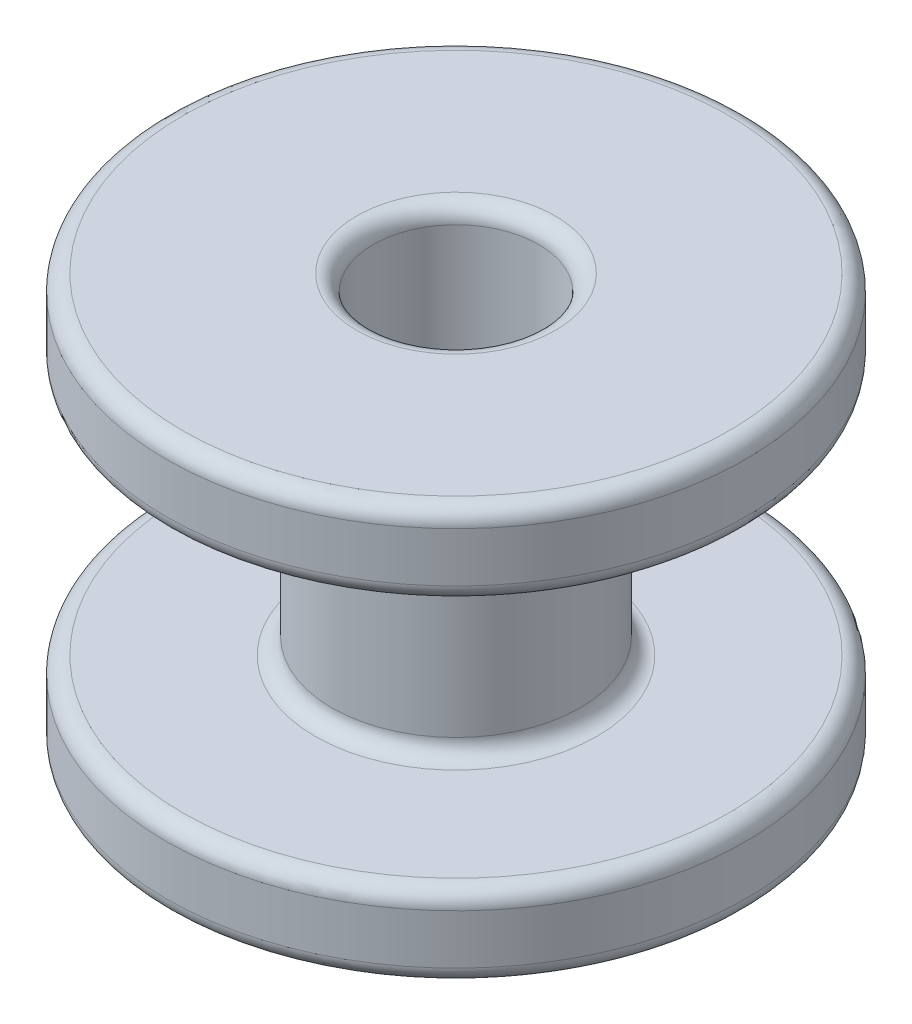
ISO-10303-21;
HEADER;
FILE_DESCRIPTION(('STEP AP214'),'2;1');
FILE_NAME('part.step','',(''),(''),'','','');
FILE_SCHEMA(('AUTOMOTIVE_DESIGN { 1 0 10303 214 1 1 1 1 }'));
ENDSEC;
DATA;
#1=APPLICATION_CONTEXT('core data for automotive mechanical design processes');
#2=APPLICATION_PROTOCOL_DEFINITION('international standard','automotive_design',2000,#1);
#3=PRODUCT_CONTEXT('',#1,'mechanical');
#4=PRODUCT('Part','Part','',(#3));
#5=PRODUCT_RELATED_PRODUCT_CATEGORY('part','',(#4));
#6=PRODUCT_DEFINITION_FORMATION('','',#4);
#7=PRODUCT_DEFINITION_CONTEXT('part definition',#1,'design');
#8=PRODUCT_DEFINITION('design','',#6,#7);
#9=PRODUCT_DEFINITION_SHAPE('','',#8);
#10=(LENGTH_UNIT() NAMED_UNIT(*) SI_UNIT(.MILLI.,.METRE.));
#11=(NAMED_UNIT(*) PLANE_ANGLE_UNIT() SI_UNIT($,.RADIAN.));
#12=(NAMED_UNIT(*) SI_UNIT($,.STERADIAN.) SOLID_ANGLE_UNIT());
#13=UNCERTAINTY_MEASURE_WITH_UNIT(LENGTH_MEASURE(1.E-05),#10,'distance_accuracy_value','');
#14=(GEOMETRIC_REPRESENTATION_CONTEXT(3) GLOBAL_UNCERTAINTY_ASSIGNED_CONTEXT((#13)) GLOBAL_UNIT_ASSIGNED_CONTEXT((#10,
#11,#12)) REPRESENTATION_CONTEXT('',''));
#15=CARTESIAN_POINT('',(0.,0.,0.));
#16=DIRECTION('',(0.,0.,1.));
#17=DIRECTION('',(1.,0.,0.));
#18=AXIS2_PLACEMENT_3D('',#15,#16,#17);
#19=CARTESIAN_POINT('',(0.,1.5,0.));
#20=DIRECTION('',(0.,-1.,0.));
#21=DIRECTION('',(0.,0.,-1.));
#22=AXIS2_PLACEMENT_3D('',#19,#20,#21);
#23=CYLINDRICAL_SURFACE('',#22,1.5);
#24=CARTESIAN_POINT('',(0.,1.3,0.));
#25=DIRECTION('',(0.,1.,0.));
#26=DIRECTION('',(0.,0.,1.));
#27=AXIS2_PLACEMENT_3D('',#24,#25,#26);
#28=CIRCLE('',#27,1.5);
#29=CARTESIAN_POINT('',(0.,1.3,1.5));
#30=VERTEX_POINT('',#29);
#31=EDGE_CURVE('E10',#30,#30,#28,.F.);
#32=ORIENTED_EDGE('',*,*,#31,.T.);
#33=EDGE_LOOP('',(#32));
#34=FACE_BOUND('',#33,.T.);
#35=CARTESIAN_POINT('',(0.,-1.3,0.));
#36=DIRECTION('',(0.,1.,0.));
#37=DIRECTION('',(0.,0.,1.));
#38=AXIS2_PLACEMENT_3D('',#35,#36,#37);
#39=CIRCLE('',#38,1.5);
#40=CARTESIAN_POINT('',(0.,-1.3,1.5));
#41=VERTEX_POINT('',#40);
#42=EDGE_CURVE('E72',#41,#41,#39,.F.);
#43=ORIENTED_EDGE('',*,*,#42,.F.);
#44=EDGE_LOOP('',(#43));
#45=FACE_BOUND('',#44,.T.);
#46=ADVANCED_FACE('F34',(#34,#45),#23,.T.);
#47=CARTESIAN_POINT('',(0.,2.5,0.));
#48=DIRECTION('',(0.,-1.,0.));
#49=DIRECTION('',(0.,0.,-1.));
#50=AXIS2_PLACEMENT_3D('',#47,#48,#49);
#51=CYLINDRICAL_SURFACE('',#50,3.5);
#52=CARTESIAN_POINT('',(0.,1.7,0.));
#53=DIRECTION('',(0.,1.,0.));
#54=DIRECTION('',(0.,0.,1.));
#55=AXIS2_PLACEMENT_3D('',#52,#53,#54);
#56=CIRCLE('',#55,3.5);
#57=CARTESIAN_POINT('',(0.,1.7,3.5));
#58=VERTEX_POINT('',#57);
#59=EDGE_CURVE('E49',#58,#58,#56,.T.);
#60=ORIENTED_EDGE('',*,*,#59,.T.);
#61=EDGE_LOOP('',(#60));
#62=FACE_BOUND('',#61,.T.);
#63=CARTESIAN_POINT('',(0.,2.3,0.));
#64=DIRECTION('',(0.,1.,0.));
#65=DIRECTION('',(0.,0.,1.));
#66=AXIS2_PLACEMENT_3D('',#63,#64,#65);
#67=CIRCLE('',#66,3.5);
#68=CARTESIAN_POINT('',(0.,2.3,3.5));
#69=VERTEX_POINT('',#68);
#70=EDGE_CURVE('E54',#69,#69,#67,.F.);
#71=ORIENTED_EDGE('',*,*,#70,.T.);
#72=EDGE_LOOP('',(#71));
#73=FACE_BOUND('',#72,.T.);
#74=ADVANCED_FACE('F121',(#62,#73),#51,.T.);
#75=CARTESIAN_POINT('',(0.,2.5,0.));
#76=DIRECTION('',(0.,1.,0.));
#77=DIRECTION('',(0.,0.,1.));
#78=AXIS2_PLACEMENT_3D('',#75,#76,#77);
#79=PLANE('',#78);
#80=CARTESIAN_POINT('',(0.,2.5,0.));
#81=DIRECTION('',(0.,1.,0.));
#82=DIRECTION('',(0.,0.,1.));
#83=AXIS2_PLACEMENT_3D('',#80,#81,#82);
#84=CIRCLE('',#83,1.2);
#85=CARTESIAN_POINT('',(0.,2.5,1.2));
#86=VERTEX_POINT('',#85);
#87=EDGE_CURVE('E60',#86,#86,#84,.F.);
#88=ORIENTED_EDGE('',*,*,#87,.T.);
#89=EDGE_LOOP('',(#88));
#90=FACE_BOUND('',#89,.T.);
#91=CARTESIAN_POINT('',(0.,2.5,0.));
#92=DIRECTION('',(0.,1.,0.));
#93=DIRECTION('',(0.,0.,1.));
#94=AXIS2_PLACEMENT_3D('',#91,#92,#93);
#95=CIRCLE('',#94,3.3);
#96=CARTESIAN_POINT('',(0.,2.5,3.3));
#97=VERTEX_POINT('',#96);
#98=EDGE_CURVE('E63',#97,#97,#95,.T.);
#99=ORIENTED_EDGE('',*,*,#98,.T.);
#100=EDGE_LOOP('',(#99));
#101=FACE_BOUND('',#100,.T.);
#102=ADVANCED_FACE('F126',(#90,#101),#79,.T.);
#103=CARTESIAN_POINT('',(0.,1.5,0.));
#104=DIRECTION('',(0.,1.,0.));
#105=DIRECTION('',(0.,0.,1.));
#106=AXIS2_PLACEMENT_3D('',#103,#104,#105);
#107=PLANE('',#106);
#108=CARTESIAN_POINT('',(0.,1.5,0.));
#109=DIRECTION('',(0.,1.,0.));
#110=DIRECTION('',(0.,0.,1.));
#111=AXIS2_PLACEMENT_3D('',#108,#109,#110);
#112=CIRCLE('',#111,1.7);
#113=CARTESIAN_POINT('',(0.,1.5,1.7));
#114=VERTEX_POINT('',#113);
#115=EDGE_CURVE('E41',#114,#114,#112,.T.);
#116=ORIENTED_EDGE('',*,*,#115,.T.);
#117=EDGE_LOOP('',(#116));
#118=FACE_BOUND('',#117,.T.);
#119=CARTESIAN_POINT('',(0.,1.5,0.));
#120=DIRECTION('',(0.,1.,0.));
#121=DIRECTION('',(0.,0.,1.));
#122=AXIS2_PLACEMENT_3D('',#119,#120,#121);
#123=CIRCLE('',#122,3.3);
#124=CARTESIAN_POINT('',(0.,1.5,3.3));
#125=VERTEX_POINT('',#124);
#126=EDGE_CURVE('E45',#125,#125,#123,.F.);
#127=ORIENTED_EDGE('',*,*,#126,.T.);
#128=EDGE_LOOP('',(#127));
#129=FACE_BOUND('',#128,.T.);
#130=ADVANCED_FACE('F157',(#118,#129),#107,.F.);
#131=CARTESIAN_POINT('',(0.,0.,0.));
#132=DIRECTION('',(0.,1.,0.));
#133=DIRECTION('',(0.,0.,1.));
#134=AXIS2_PLACEMENT_3D('',#131,#132,#133);
#135=CYLINDRICAL_SURFACE('',#134,1.);
#136=CARTESIAN_POINT('',(0.,2.3,0.));
#137=DIRECTION('',(0.,1.,0.));
#138=DIRECTION('',(0.,0.,1.));
#139=AXIS2_PLACEMENT_3D('',#136,#137,#138);
#140=CIRCLE('',#139,1.);
#141=CARTESIAN_POINT('',(0.,2.3,1.));
#142=VERTEX_POINT('',#141);
#143=EDGE_CURVE('E66',#142,#142,#140,.T.);
#144=ORIENTED_EDGE('',*,*,#143,.T.);
#145=EDGE_LOOP('',(#144));
#146=FACE_BOUND('',#145,.T.);
#147=CARTESIAN_POINT('',(0.,0.2,0.));
#148=DIRECTION('',(0.,1.,0.));
#149=DIRECTION('',(0.,0.,1.));
#150=AXIS2_PLACEMENT_3D('',#147,#148,#149);
#151=CIRCLE('',#150,1.);
#152=CARTESIAN_POINT('',(0.,0.2,1.));
#153=VERTEX_POINT('',#152);
#154=EDGE_CURVE('E69',#153,#153,#151,.F.);
#155=ORIENTED_EDGE('',*,*,#154,.T.);
#156=EDGE_LOOP('',(#155));
#157=FACE_BOUND('',#156,.T.);
#158=ADVANCED_FACE('F136',(#146,#157),#135,.F.);
#159=CARTESIAN_POINT('',(0.,2.3,0.));
#160=DIRECTION('',(0.,1.,0.));
#161=DIRECTION('',(0.,0.,1.));
#162=AXIS2_PLACEMENT_3D('',#159,#160,#161);
#163=TOROIDAL_SURFACE('',#162,1.2,0.2);
#164=ORIENTED_EDGE('',*,*,#87,.F.);
#165=EDGE_LOOP('',(#164));
#166=FACE_BOUND('',#165,.T.);
#167=ORIENTED_EDGE('',*,*,#143,.F.);
#168=EDGE_LOOP('',(#167));
#169=FACE_BOUND('',#168,.T.);
#170=ADVANCED_FACE('F132',(#166,#169),#163,.T.);
#171=CARTESIAN_POINT('',(0.,0.2,0.));
#172=DIRECTION('',(0.,1.,0.));
#173=DIRECTION('',(0.,0.,1.));
#174=AXIS2_PLACEMENT_3D('',#171,#172,#173);
#175=TOROIDAL_SURFACE('',#174,1.2,0.2);
#176=ORIENTED_EDGE('',*,*,#154,.F.);
#177=EDGE_LOOP('',(#176));
#178=FACE_BOUND('',#177,.T.);
#179=CARTESIAN_POINT('',(0.,0.,0.));
#180=DIRECTION('',(0.,1.,0.));
#181=DIRECTION('',(0.,0.,1.));
#182=AXIS2_PLACEMENT_3D('',#179,#180,#181);
#183=CIRCLE('',#182,1.2);
#184=CARTESIAN_POINT('',(0.,0.,1.2));
#185=VERTEX_POINT('',#184);
#186=EDGE_CURVE('E57',#185,#185,#183,.T.);
#187=ORIENTED_EDGE('',*,*,#186,.F.);
#188=EDGE_LOOP('',(#187));
#189=FACE_BOUND('',#188,.T.);
#190=ADVANCED_FACE('F135',(#178,#189),#175,.T.);
#191=CARTESIAN_POINT('',(0.,1.7,0.));
#192=DIRECTION('',(0.,1.,0.));
#193=DIRECTION('',(0.,0.,1.));
#194=AXIS2_PLACEMENT_3D('',#191,#192,#193);
#195=TOROIDAL_SURFACE('',#194,3.3,0.2);
#196=ORIENTED_EDGE('',*,*,#126,.F.);
#197=EDGE_LOOP('',(#196));
#198=FACE_BOUND('',#197,.T.);
#199=ORIENTED_EDGE('',*,*,#59,.F.);
#200=EDGE_LOOP('',(#199));
#201=FACE_BOUND('',#200,.T.);
#202=ADVANCED_FACE('F140',(#198,#201),#195,.T.);
#203=CARTESIAN_POINT('',(0.,2.3,0.));
#204=DIRECTION('',(0.,1.,0.));
#205=DIRECTION('',(0.,0.,1.));
#206=AXIS2_PLACEMENT_3D('',#203,#204,#205);
#207=TOROIDAL_SURFACE('',#206,3.3,0.2);
#208=ORIENTED_EDGE('',*,*,#70,.F.);
#209=EDGE_LOOP('',(#208));
#210=FACE_BOUND('',#209,.T.);
#211=ORIENTED_EDGE('',*,*,#98,.F.);
#212=EDGE_LOOP('',(#211));
#213=FACE_BOUND('',#212,.T.);
#214=ADVANCED_FACE('F143',(#210,#213),#207,.T.);
#215=CARTESIAN_POINT('',(0.,1.3,0.));
#216=DIRECTION('',(0.,1.,0.));
#217=DIRECTION('',(0.,0.,1.));
#218=AXIS2_PLACEMENT_3D('',#215,#216,#217);
#219=TOROIDAL_SURFACE('',#218,1.7,0.2);
#220=ORIENTED_EDGE('',*,*,#31,.F.);
#221=EDGE_LOOP('',(#220));
#222=FACE_BOUND('',#221,.T.);
#223=ORIENTED_EDGE('',*,*,#115,.F.);
#224=EDGE_LOOP('',(#223));
#225=FACE_BOUND('',#224,.T.);
#226=ADVANCED_FACE('F36',(#222,#225),#219,.F.);
#227=CARTESIAN_POINT('',(0.,-2.5,0.));
#228=DIRECTION('',(0.,1.,0.));
#229=DIRECTION('',(0.,0.,-1.));
#230=AXIS2_PLACEMENT_3D('',#227,#228,#229);
#231=CYLINDRICAL_SURFACE('',#230,3.5);
#232=CARTESIAN_POINT('',(0.,-1.7,0.));
#233=DIRECTION('',(0.,1.,0.));
#234=DIRECTION('',(0.,0.,1.));
#235=AXIS2_PLACEMENT_3D('',#232,#233,#234);
#236=CIRCLE('',#235,3.5);
#237=CARTESIAN_POINT('',(0.,-1.7,3.5));
#238=VERTEX_POINT('',#237);
#239=EDGE_CURVE('E81',#238,#238,#236,.T.);
#240=ORIENTED_EDGE('',*,*,#239,.F.);
#241=EDGE_LOOP('',(#240));
#242=FACE_BOUND('',#241,.T.);
#243=CARTESIAN_POINT('',(0.,-2.3,0.));
#244=DIRECTION('',(0.,1.,0.));
#245=DIRECTION('',(0.,0.,1.));
#246=AXIS2_PLACEMENT_3D('',#243,#244,#245);
#247=CIRCLE('',#246,3.5);
#248=CARTESIAN_POINT('',(0.,-2.3,3.5));
#249=VERTEX_POINT('',#248);
#250=EDGE_CURVE('E84',#249,#249,#247,.F.);
#251=ORIENTED_EDGE('',*,*,#250,.F.);
#252=EDGE_LOOP('',(#251));
#253=FACE_BOUND('',#252,.T.);
#254=ADVANCED_FACE('F150',(#242,#253),#231,.T.);
#255=CARTESIAN_POINT('',(0.,-2.5,0.));
#256=DIRECTION('',(0.,-1.,0.));
#257=DIRECTION('',(0.,0.,1.));
#258=AXIS2_PLACEMENT_3D('',#255,#256,#257);
#259=PLANE('',#258);
#260=CARTESIAN_POINT('',(0.,-2.5,0.));
#261=DIRECTION('',(0.,1.,0.));
#262=DIRECTION('',(0.,0.,1.));
#263=AXIS2_PLACEMENT_3D('',#260,#261,#262);
#264=CIRCLE('',#263,1.2);
#265=CARTESIAN_POINT('',(0.,-2.5,1.2));
#266=VERTEX_POINT('',#265);
#267=EDGE_CURVE('E87',#266,#266,#264,.F.);
#268=ORIENTED_EDGE('',*,*,#267,.F.);
#269=EDGE_LOOP('',(#268));
#270=FACE_BOUND('',#269,.T.);
#271=CARTESIAN_POINT('',(0.,-2.5,0.));
#272=DIRECTION('',(0.,1.,0.));
#273=DIRECTION('',(0.,0.,1.));
#274=AXIS2_PLACEMENT_3D('',#271,#272,#273);
#275=CIRCLE('',#274,3.3);
#276=CARTESIAN_POINT('',(0.,-2.5,3.3));
#277=VERTEX_POINT('',#276);
#278=EDGE_CURVE('E90',#277,#277,#275,.T.);
#279=ORIENTED_EDGE('',*,*,#278,.F.);
#280=EDGE_LOOP('',(#279));
#281=FACE_BOUND('',#280,.T.);
#282=ADVANCED_FACE('F115',(#270,#281),#259,.T.);
#283=CARTESIAN_POINT('',(0.,-1.5,0.));
#284=DIRECTION('',(0.,-1.,0.));
#285=DIRECTION('',(0.,0.,1.));
#286=AXIS2_PLACEMENT_3D('',#283,#284,#285);
#287=PLANE('',#286);
#288=CARTESIAN_POINT('',(0.,-1.5,0.));
#289=DIRECTION('',(0.,1.,0.));
#290=DIRECTION('',(0.,0.,1.));
#291=AXIS2_PLACEMENT_3D('',#288,#289,#290);
#292=CIRCLE('',#291,1.7);
#293=CARTESIAN_POINT('',(0.,-1.5,1.7));
#294=VERTEX_POINT('',#293);
#295=EDGE_CURVE('E75',#294,#294,#292,.T.);
#296=ORIENTED_EDGE('',*,*,#295,.F.);
#297=EDGE_LOOP('',(#296));
#298=FACE_BOUND('',#297,.T.);
#299=CARTESIAN_POINT('',(0.,-1.5,0.));
#300=DIRECTION('',(0.,1.,0.));
#301=DIRECTION('',(0.,0.,1.));
#302=AXIS2_PLACEMENT_3D('',#299,#300,#301);
#303=CIRCLE('',#302,3.3);
#304=CARTESIAN_POINT('',(0.,-1.5,3.3));
#305=VERTEX_POINT('',#304);
#306=EDGE_CURVE('E78',#305,#305,#303,.F.);
#307=ORIENTED_EDGE('',*,*,#306,.F.);
#308=EDGE_LOOP('',(#307));
#309=FACE_BOUND('',#308,.T.);
#310=ADVANCED_FACE('F106',(#298,#309),#287,.F.);
#311=CARTESIAN_POINT('',(0.,0.,0.));
#312=DIRECTION('',(0.,-1.,0.));
#313=DIRECTION('',(0.,0.,1.));
#314=AXIS2_PLACEMENT_3D('',#311,#312,#313);
#315=CYLINDRICAL_SURFACE('',#314,1.);
#316=CARTESIAN_POINT('',(0.,-2.3,0.));
#317=DIRECTION('',(0.,1.,0.));
#318=DIRECTION('',(0.,0.,1.));
#319=AXIS2_PLACEMENT_3D('',#316,#317,#318);
#320=CIRCLE('',#319,1.);
#321=CARTESIAN_POINT('',(0.,-2.3,1.));
#322=VERTEX_POINT('',#321);
#323=EDGE_CURVE('E93',#322,#322,#320,.T.);
#324=ORIENTED_EDGE('',*,*,#323,.F.);
#325=EDGE_LOOP('',(#324));
#326=FACE_BOUND('',#325,.T.);
#327=CARTESIAN_POINT('',(0.,-0.2,0.));
#328=DIRECTION('',(0.,1.,0.));
#329=DIRECTION('',(0.,0.,1.));
#330=AXIS2_PLACEMENT_3D('',#327,#328,#329);
#331=CIRCLE('',#330,1.);
#332=CARTESIAN_POINT('',(0.,-0.2,1.));
#333=VERTEX_POINT('',#332);
#334=EDGE_CURVE('E96',#333,#333,#331,.F.);
#335=ORIENTED_EDGE('',*,*,#334,.F.);
#336=EDGE_LOOP('',(#335));
#337=FACE_BOUND('',#336,.T.);
#338=ADVANCED_FACE('F103',(#326,#337),#315,.F.);
#339=CARTESIAN_POINT('',(0.,-2.3,0.));
#340=DIRECTION('',(0.,-1.,0.));
#341=DIRECTION('',(0.,0.,1.));
#342=AXIS2_PLACEMENT_3D('',#339,#340,#341);
#343=TOROIDAL_SURFACE('',#342,1.2,0.2);
#344=ORIENTED_EDGE('',*,*,#267,.T.);
#345=EDGE_LOOP('',(#344));
#346=FACE_BOUND('',#345,.T.);
#347=ORIENTED_EDGE('',*,*,#323,.T.);
#348=EDGE_LOOP('',(#347));
#349=FACE_BOUND('',#348,.T.);
#350=ADVANCED_FACE('F105',(#346,#349),#343,.T.);
#351=CARTESIAN_POINT('',(0.,-0.2,0.));
#352=DIRECTION('',(0.,-1.,0.));
#353=DIRECTION('',(0.,0.,1.));
#354=AXIS2_PLACEMENT_3D('',#351,#352,#353);
#355=TOROIDAL_SURFACE('',#354,1.2,0.2);
#356=ORIENTED_EDGE('',*,*,#334,.T.);
#357=EDGE_LOOP('',(#356));
#358=FACE_BOUND('',#357,.T.);
#359=ORIENTED_EDGE('',*,*,#186,.T.);
#360=EDGE_LOOP('',(#359));
#361=FACE_BOUND('',#360,.T.);
#362=ADVANCED_FACE('F100',(#358,#361),#355,.T.);
#363=CARTESIAN_POINT('',(0.,-1.7,0.));
#364=DIRECTION('',(0.,-1.,0.));
#365=DIRECTION('',(0.,0.,1.));
#366=AXIS2_PLACEMENT_3D('',#363,#364,#365);
#367=TOROIDAL_SURFACE('',#366,3.3,0.2);
#368=ORIENTED_EDGE('',*,*,#306,.T.);
#369=EDGE_LOOP('',(#368));
#370=FACE_BOUND('',#369,.T.);
#371=ORIENTED_EDGE('',*,*,#239,.T.);
#372=EDGE_LOOP('',(#371));
#373=FACE_BOUND('',#372,.T.);
#374=ADVANCED_FACE('F174',(#370,#373),#367,.T.);
#375=CARTESIAN_POINT('',(0.,-2.3,0.));
#376=DIRECTION('',(0.,-1.,0.));
#377=DIRECTION('',(0.,0.,1.));
#378=AXIS2_PLACEMENT_3D('',#375,#376,#377);
#379=TOROIDAL_SURFACE('',#378,3.3,0.2);
#380=ORIENTED_EDGE('',*,*,#250,.T.);
#381=EDGE_LOOP('',(#380));
#382=FACE_BOUND('',#381,.T.);
#383=ORIENTED_EDGE('',*,*,#278,.T.);
#384=EDGE_LOOP('',(#383));
#385=FACE_BOUND('',#384,.T.);
#386=ADVANCED_FACE('F170',(#382,#385),#379,.T.);
#387=CARTESIAN_POINT('',(0.,-1.3,0.));
#388=DIRECTION('',(0.,-1.,0.));
#389=DIRECTION('',(0.,0.,1.));
#390=AXIS2_PLACEMENT_3D('',#387,#388,#389);
#391=TOROIDAL_SURFACE('',#390,1.7,0.2);
#392=ORIENTED_EDGE('',*,*,#42,.T.);
#393=EDGE_LOOP('',(#392));
#394=FACE_BOUND('',#393,.T.);
#395=ORIENTED_EDGE('',*,*,#295,.T.);
#396=EDGE_LOOP('',(#395));
#397=FACE_BOUND('',#396,.T.);
#398=ADVANCED_FACE('F167',(#394,#397),#391,.F.);
#399=CLOSED_SHELL('',(#46,#74,#102,#130,#158,#170,#190,#202,#214,#226,#254,#282,#310,#338,#350,
#362,#374,#386,#398));
#400=MANIFOLD_SOLID_BREP('B2',#399);
#401=ADVANCED_BREP_SHAPE_REPRESENTATION('',(#18,#400),#14);
#402=SHAPE_DEFINITION_REPRESENTATION(#9,#401);
ENDSEC;
END-ISO-10303-21;
